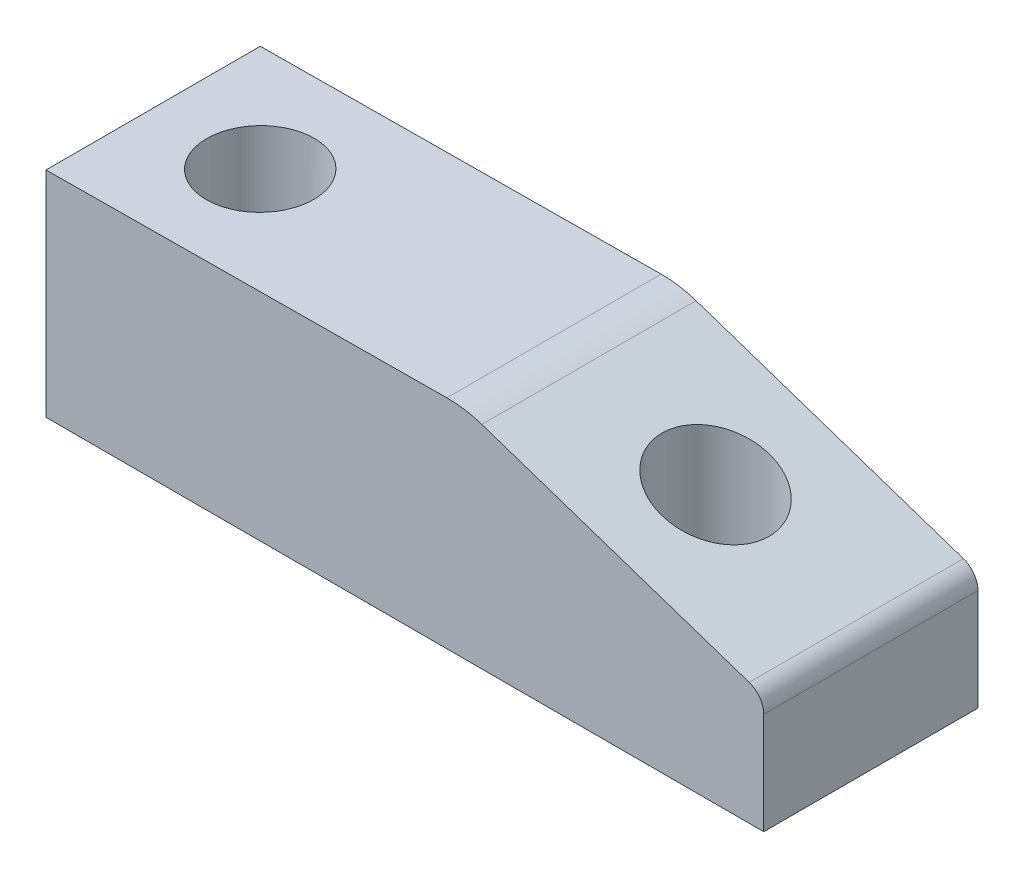
ISO-10303-21;
HEADER;
FILE_DESCRIPTION(('STEP AP214'),'2;1');
FILE_NAME('part.step','',(''),(''),'','','');
FILE_SCHEMA(('AUTOMOTIVE_DESIGN { 1 0 10303 214 1 1 1 1 }'));
ENDSEC;
DATA;
#1=APPLICATION_CONTEXT('core data for automotive mechanical design processes');
#2=APPLICATION_PROTOCOL_DEFINITION('international standard','automotive_design',2000,#1);
#3=PRODUCT_CONTEXT('',#1,'mechanical');
#4=PRODUCT('Part','Part','',(#3));
#5=PRODUCT_RELATED_PRODUCT_CATEGORY('part','',(#4));
#6=PRODUCT_DEFINITION_FORMATION('','',#4);
#7=PRODUCT_DEFINITION_CONTEXT('part definition',#1,'design');
#8=PRODUCT_DEFINITION('design','',#6,#7);
#9=PRODUCT_DEFINITION_SHAPE('','',#8);
#10=(LENGTH_UNIT() NAMED_UNIT(*) SI_UNIT(.MILLI.,.METRE.));
#11=(NAMED_UNIT(*) PLANE_ANGLE_UNIT() SI_UNIT($,.RADIAN.));
#12=(NAMED_UNIT(*) SI_UNIT($,.STERADIAN.) SOLID_ANGLE_UNIT());
#13=UNCERTAINTY_MEASURE_WITH_UNIT(LENGTH_MEASURE(1.E-05),#10,'distance_accuracy_value','');
#14=(GEOMETRIC_REPRESENTATION_CONTEXT(3) GLOBAL_UNCERTAINTY_ASSIGNED_CONTEXT((#13)) GLOBAL_UNIT_ASSIGNED_CONTEXT((#10,
#11,#12)) REPRESENTATION_CONTEXT('',''));
#15=CARTESIAN_POINT('',(0.,0.,0.));
#16=DIRECTION('',(0.,0.,1.));
#17=DIRECTION('',(1.,0.,0.));
#18=AXIS2_PLACEMENT_3D('',#15,#16,#17);
#19=CARTESIAN_POINT('',(81.3639693898569,39.5436866750321,20.));
#20=DIRECTION('',(-0.318198469492847,-0.948024121007694,0.));
#21=DIRECTION('',(0.948024121007694,-0.318198469492847,0.));
#22=AXIS2_PLACEMENT_3D('',#19,#20,#21);
#23=PLANE('',#22);
#24=DIRECTION('',(-0.948024121007693,0.318198469492847,0.));
#25=VECTOR('',#24,1.);
#26=CARTESIAN_POINT('',(81.3639693898569,39.5436866750321,-20.));
#27=LINE('',#26,#25);
#28=CARTESIAN_POINT('',(131.272793877971,22.7920964840308,-20.));
#29=VERTEX_POINT('',#28);
#30=CARTESIAN_POINT('',(81.3639693898569,39.5436866750321,-20.));
#31=VERTEX_POINT('',#30);
#32=EDGE_CURVE('E139',#29,#31,#27,.T.);
#33=ORIENTED_EDGE('',*,*,#32,.T.);
#34=DIRECTION('',(0.,0.,-1.));
#35=VECTOR('',#34,1.);
#36=CARTESIAN_POINT('',(81.3639693898569,39.5436866750321,20.));
#37=LINE('',#36,#35);
#38=CARTESIAN_POINT('',(81.3639693898569,39.5436866750321,20.));
#39=VERTEX_POINT('',#38);
#40=EDGE_CURVE('E121',#39,#31,#37,.T.);
#41=ORIENTED_EDGE('',*,*,#40,.F.);
#42=DIRECTION('',(-0.948024121007693,0.318198469492847,0.));
#43=VECTOR('',#42,1.);
#44=CARTESIAN_POINT('',(81.3639693898569,39.5436866750321,20.));
#45=LINE('',#44,#43);
#46=CARTESIAN_POINT('',(131.272793877971,22.7920964840308,20.));
#47=VERTEX_POINT('',#46);
#48=EDGE_CURVE('E112',#47,#39,#45,.T.);
#49=ORIENTED_EDGE('',*,*,#48,.F.);
#50=DIRECTION('',(0.,0.,-1.));
#51=VECTOR('',#50,1.);
#52=CARTESIAN_POINT('',(131.272793877971,22.7920964840308,20.));
#53=LINE('',#52,#51);
#54=EDGE_CURVE('E148',#47,#29,#53,.T.);
#55=ORIENTED_EDGE('',*,*,#54,.T.);
#56=EDGE_LOOP('',(#33,#41,#49,#55));
#57=FACE_BOUND('',#56,.T.);
#58=CARTESIAN_POINT('',(105.,31.6103982719488,0.));
#59=DIRECTION('',(-0.318198469492847,-0.948024121007694,0.));
#60=DIRECTION('',(0.948024121007694,-0.318198469492847,0.));
#61=AXIS2_PLACEMENT_3D('',#58,#59,#60);
#62=ELLIPSE('',#61,10.5482548158907,9.99999999999999);
#63=CARTESIAN_POINT('',(115.,28.2539597337118,0.));
#64=VERTEX_POINT('',#63);
#65=EDGE_CURVE('E41',#64,#64,#62,.F.);
#66=ORIENTED_EDGE('',*,*,#65,.F.);
#67=EDGE_LOOP('',(#66));
#68=FACE_BOUND('',#67,.T.);
#69=ADVANCED_FACE('F37',(#57,#68),#23,.F.);
#70=CARTESIAN_POINT('',(0.,40.,20.));
#71=DIRECTION('',(0.00778389982458456,-0.999969704992867,0.));
#72=DIRECTION('',(0.999969704992867,0.00778389982458456,0.));
#73=AXIS2_PLACEMENT_3D('',#70,#71,#72);
#74=PLANE('',#73);
#75=DIRECTION('',(-0.999969704992867,-0.00778389982458455,0.));
#76=VECTOR('',#75,1.);
#77=CARTESIAN_POINT('',(0.,40.,-20.));
#78=LINE('',#77,#76);
#79=CARTESIAN_POINT('',(74.8443220035083,40.5825983547356,-20.));
#80=VERTEX_POINT('',#79);
#81=CARTESIAN_POINT('',(0.,40.,-20.));
#82=VERTEX_POINT('',#81);
#83=EDGE_CURVE('E82',#80,#82,#78,.T.);
#84=ORIENTED_EDGE('',*,*,#83,.T.);
#85=DIRECTION('',(0.,0.,-1.));
#86=VECTOR('',#85,1.);
#87=CARTESIAN_POINT('',(0.,40.,20.));
#88=LINE('',#87,#86);
#89=CARTESIAN_POINT('',(0.,40.,20.));
#90=VERTEX_POINT('',#89);
#91=EDGE_CURVE('E122',#90,#82,#88,.T.);
#92=ORIENTED_EDGE('',*,*,#91,.F.);
#93=DIRECTION('',(-0.999969704992867,-0.00778389982458455,0.));
#94=VECTOR('',#93,1.);
#95=CARTESIAN_POINT('',(0.,40.,20.));
#96=LINE('',#95,#94);
#97=CARTESIAN_POINT('',(74.8443220035083,40.5825983547356,20.));
#98=VERTEX_POINT('',#97);
#99=EDGE_CURVE('E110',#98,#90,#96,.T.);
#100=ORIENTED_EDGE('',*,*,#99,.F.);
#101=DIRECTION('',(0.,0.,-1.));
#102=VECTOR('',#101,1.);
#103=CARTESIAN_POINT('',(74.8443220035083,40.5825983547356,20.));
#104=LINE('',#103,#102);
#105=EDGE_CURVE('E117',#98,#80,#104,.T.);
#106=ORIENTED_EDGE('',*,*,#105,.T.);
#107=EDGE_LOOP('',(#84,#92,#100,#106));
#108=FACE_BOUND('',#107,.T.);
#109=CARTESIAN_POINT('',(20.,40.1556827129006,0.));
#110=DIRECTION('',(0.00778389982458456,-0.999969704992867,0.));
#111=DIRECTION('',(-0.999969704992867,-0.00778389982458456,0.));
#112=AXIS2_PLACEMENT_3D('',#109,#110,#111);
#113=ELLIPSE('',#112,10.0003029592495,10.);
#114=CARTESIAN_POINT('',(10.,40.0778413564503,0.));
#115=VERTEX_POINT('',#114);
#116=EDGE_CURVE('E152',#115,#115,#113,.F.);
#117=ORIENTED_EDGE('',*,*,#116,.F.);
#118=EDGE_LOOP('',(#117));
#119=FACE_BOUND('',#118,.T.);
#120=ADVANCED_FACE('F124',(#108,#119),#74,.F.);
#121=CARTESIAN_POINT('',(20.,40.5832042548782,0.));
#122=DIRECTION('',(0.,-1.,0.));
#123=DIRECTION('',(0.,0.,-1.));
#124=AXIS2_PLACEMENT_3D('',#121,#122,#123);
#125=CYLINDRICAL_SURFACE('',#124,6.);
#126=CARTESIAN_POINT('',(20.,0.,0.));
#127=DIRECTION('',(0.,1.,0.));
#128=DIRECTION('',(0.,0.,1.));
#129=AXIS2_PLACEMENT_3D('',#126,#127,#128);
#130=CIRCLE('',#129,6.);
#131=CARTESIAN_POINT('',(20.,0.,6.));
#132=VERTEX_POINT('',#131);
#133=EDGE_CURVE('E135',#132,#132,#130,.T.);
#134=ORIENTED_EDGE('',*,*,#133,.F.);
#135=EDGE_LOOP('',(#134));
#136=FACE_BOUND('',#135,.T.);
#137=CARTESIAN_POINT('',(20.,10.,0.));
#138=DIRECTION('',(0.,1.,0.));
#139=DIRECTION('',(0.,0.,1.));
#140=AXIS2_PLACEMENT_3D('',#137,#138,#139);
#141=CIRCLE('',#140,6.);
#142=CARTESIAN_POINT('',(20.,10.,6.));
#143=VERTEX_POINT('',#142);
#144=EDGE_CURVE('E160',#143,#143,#141,.T.);
#145=ORIENTED_EDGE('',*,*,#144,.T.);
#146=EDGE_LOOP('',(#145));
#147=FACE_BOUND('',#146,.T.);
#148=ADVANCED_FACE('F210',(#136,#147),#125,.F.);
#149=CARTESIAN_POINT('',(105.,40.5832042548782,0.));
#150=DIRECTION('',(0.,-1.,0.));
#151=DIRECTION('',(0.,0.,-1.));
#152=AXIS2_PLACEMENT_3D('',#149,#150,#151);
#153=CYLINDRICAL_SURFACE('',#152,6.);
#154=CARTESIAN_POINT('',(105.,0.,0.));
#155=DIRECTION('',(0.,1.,0.));
#156=DIRECTION('',(0.,0.,1.));
#157=AXIS2_PLACEMENT_3D('',#154,#155,#156);
#158=CIRCLE('',#157,6.);
#159=CARTESIAN_POINT('',(105.,0.,6.));
#160=VERTEX_POINT('',#159);
#161=EDGE_CURVE('E158',#160,#160,#158,.T.);
#162=ORIENTED_EDGE('',*,*,#161,.F.);
#163=EDGE_LOOP('',(#162));
#164=FACE_BOUND('',#163,.T.);
#165=CARTESIAN_POINT('',(105.,10.,0.));
#166=DIRECTION('',(0.,1.,0.));
#167=DIRECTION('',(0.,0.,1.));
#168=AXIS2_PLACEMENT_3D('',#165,#166,#167);
#169=CIRCLE('',#168,6.);
#170=CARTESIAN_POINT('',(105.,10.,6.));
#171=VERTEX_POINT('',#170);
#172=EDGE_CURVE('E168',#171,#171,#169,.T.);
#173=ORIENTED_EDGE('',*,*,#172,.T.);
#174=EDGE_LOOP('',(#173));
#175=FACE_BOUND('',#174,.T.);
#176=ADVANCED_FACE('F218',(#164,#175),#153,.F.);
#177=CARTESIAN_POINT('',(134.,0.,20.));
#178=DIRECTION('',(0.,1.,0.));
#179=DIRECTION('',(-1.,0.,0.));
#180=AXIS2_PLACEMENT_3D('',#177,#178,#179);
#181=PLANE('',#180);
#182=ORIENTED_EDGE('',*,*,#133,.T.);
#183=EDGE_LOOP('',(#182));
#184=FACE_BOUND('',#183,.T.);
#185=ORIENTED_EDGE('',*,*,#161,.T.);
#186=EDGE_LOOP('',(#185));
#187=FACE_BOUND('',#186,.T.);
#188=DIRECTION('',(1.,0.,0.));
#189=VECTOR('',#188,1.);
#190=CARTESIAN_POINT('',(134.,0.,-20.));
#191=LINE('',#190,#189);
#192=CARTESIAN_POINT('',(0.,0.,-20.));
#193=VERTEX_POINT('',#192);
#194=CARTESIAN_POINT('',(134.,0.,-20.));
#195=VERTEX_POINT('',#194);
#196=EDGE_CURVE('E131',#193,#195,#191,.T.);
#197=ORIENTED_EDGE('',*,*,#196,.T.);
#198=DIRECTION('',(0.,0.,-1.));
#199=VECTOR('',#198,1.);
#200=CARTESIAN_POINT('',(134.,0.,20.));
#201=LINE('',#200,#199);
#202=CARTESIAN_POINT('',(134.,0.,20.));
#203=VERTEX_POINT('',#202);
#204=EDGE_CURVE('E11',#203,#195,#201,.T.);
#205=ORIENTED_EDGE('',*,*,#204,.F.);
#206=DIRECTION('',(1.,0.,0.));
#207=VECTOR('',#206,1.);
#208=CARTESIAN_POINT('',(134.,0.,20.));
#209=LINE('',#208,#207);
#210=CARTESIAN_POINT('',(0.,0.,20.));
#211=VERTEX_POINT('',#210);
#212=EDGE_CURVE('E144',#211,#203,#209,.T.);
#213=ORIENTED_EDGE('',*,*,#212,.F.);
#214=DIRECTION('',(0.,0.,-1.));
#215=VECTOR('',#214,1.);
#216=CARTESIAN_POINT('',(0.,0.,20.));
#217=LINE('',#216,#215);
#218=EDGE_CURVE('E127',#211,#193,#217,.T.);
#219=ORIENTED_EDGE('',*,*,#218,.T.);
#220=EDGE_LOOP('',(#197,#205,#213,#219));
#221=FACE_BOUND('',#220,.T.);
#222=ADVANCED_FACE('F39',(#184,#187,#221),#181,.F.);
#223=CARTESIAN_POINT('',(134.,19.,20.));
#224=DIRECTION('',(-1.,0.,0.));
#225=DIRECTION('',(0.,0.,1.));
#226=AXIS2_PLACEMENT_3D('',#223,#224,#225);
#227=PLANE('',#226);
#228=DIRECTION('',(0.,1.,0.));
#229=VECTOR('',#228,1.);
#230=CARTESIAN_POINT('',(134.,19.,-20.));
#231=LINE('',#230,#229);
#232=CARTESIAN_POINT('',(134.,19.,-20.));
#233=VERTEX_POINT('',#232);
#234=EDGE_CURVE('E134',#195,#233,#231,.T.);
#235=ORIENTED_EDGE('',*,*,#234,.T.);
#236=DIRECTION('',(0.,0.,-1.));
#237=VECTOR('',#236,1.);
#238=CARTESIAN_POINT('',(134.,19.,20.));
#239=LINE('',#238,#237);
#240=CARTESIAN_POINT('',(134.,19.,20.));
#241=VERTEX_POINT('',#240);
#242=EDGE_CURVE('E47',#241,#233,#239,.T.);
#243=ORIENTED_EDGE('',*,*,#242,.F.);
#244=DIRECTION('',(0.,1.,0.));
#245=VECTOR('',#244,1.);
#246=CARTESIAN_POINT('',(134.,19.,20.));
#247=LINE('',#246,#245);
#248=EDGE_CURVE('E96',#203,#241,#247,.T.);
#249=ORIENTED_EDGE('',*,*,#248,.F.);
#250=ORIENTED_EDGE('',*,*,#204,.T.);
#251=EDGE_LOOP('',(#235,#243,#249,#250));
#252=FACE_BOUND('',#251,.T.);
#253=ADVANCED_FACE('F213',(#252),#227,.F.);
#254=CARTESIAN_POINT('',(130.,19.,20.));
#255=DIRECTION('',(0.,0.,-1.));
#256=DIRECTION('',(-1.,0.,0.));
#257=AXIS2_PLACEMENT_3D('',#254,#255,#256);
#258=CYLINDRICAL_SURFACE('',#257,4.);
#259=CARTESIAN_POINT('',(130.,19.,-20.));
#260=DIRECTION('',(0.,0.,1.));
#261=DIRECTION('',(-1.,0.,0.));
#262=AXIS2_PLACEMENT_3D('',#259,#260,#261);
#263=CIRCLE('',#262,4.);
#264=EDGE_CURVE('E137',#233,#29,#263,.T.);
#265=ORIENTED_EDGE('',*,*,#264,.T.);
#266=ORIENTED_EDGE('',*,*,#54,.F.);
#267=CARTESIAN_POINT('',(130.,19.,20.));
#268=DIRECTION('',(0.,0.,1.));
#269=DIRECTION('',(-1.,0.,0.));
#270=AXIS2_PLACEMENT_3D('',#267,#268,#269);
#271=CIRCLE('',#270,4.);
#272=EDGE_CURVE('E179',#241,#47,#271,.T.);
#273=ORIENTED_EDGE('',*,*,#272,.F.);
#274=ORIENTED_EDGE('',*,*,#242,.T.);
#275=EDGE_LOOP('',(#265,#266,#273,#274));
#276=FACE_BOUND('',#275,.T.);
#277=ADVANCED_FACE('F183',(#276),#258,.T.);
#278=CARTESIAN_POINT('',(75.,20.5832042548782,20.));
#279=DIRECTION('',(0.,0.,-1.));
#280=DIRECTION('',(-1.,0.,0.));
#281=AXIS2_PLACEMENT_3D('',#278,#279,#280);
#282=CYLINDRICAL_SURFACE('',#281,20.);
#283=CARTESIAN_POINT('',(75.,20.5832042548782,-20.));
#284=DIRECTION('',(0.,0.,1.));
#285=DIRECTION('',(1.,0.,0.));
#286=AXIS2_PLACEMENT_3D('',#283,#284,#285);
#287=CIRCLE('',#286,20.);
#288=EDGE_CURVE('E120',#31,#80,#287,.T.);
#289=ORIENTED_EDGE('',*,*,#288,.T.);
#290=ORIENTED_EDGE('',*,*,#105,.F.);
#291=CARTESIAN_POINT('',(75.,20.5832042548782,20.));
#292=DIRECTION('',(0.,0.,1.));
#293=DIRECTION('',(1.,0.,0.));
#294=AXIS2_PLACEMENT_3D('',#291,#292,#293);
#295=CIRCLE('',#294,20.);
#296=EDGE_CURVE('E106',#39,#98,#295,.T.);
#297=ORIENTED_EDGE('',*,*,#296,.F.);
#298=ORIENTED_EDGE('',*,*,#40,.T.);
#299=EDGE_LOOP('',(#289,#290,#297,#298));
#300=FACE_BOUND('',#299,.T.);
#301=ADVANCED_FACE('F118',(#300),#282,.T.);
#302=CARTESIAN_POINT('',(0.,0.,20.));
#303=DIRECTION('',(1.,0.,0.));
#304=DIRECTION('',(0.,0.,-1.));
#305=AXIS2_PLACEMENT_3D('',#302,#303,#304);
#306=PLANE('',#305);
#307=DIRECTION('',(0.,-1.,0.));
#308=VECTOR('',#307,1.);
#309=CARTESIAN_POINT('',(0.,0.,-20.));
#310=LINE('',#309,#308);
#311=EDGE_CURVE('E88',#82,#193,#310,.T.);
#312=ORIENTED_EDGE('',*,*,#311,.T.);
#313=ORIENTED_EDGE('',*,*,#218,.F.);
#314=DIRECTION('',(0.,-1.,0.));
#315=VECTOR('',#314,1.);
#316=CARTESIAN_POINT('',(0.,0.,20.));
#317=LINE('',#316,#315);
#318=EDGE_CURVE('E56',#90,#211,#317,.T.);
#319=ORIENTED_EDGE('',*,*,#318,.F.);
#320=ORIENTED_EDGE('',*,*,#91,.T.);
#321=EDGE_LOOP('',(#312,#313,#319,#320));
#322=FACE_BOUND('',#321,.T.);
#323=ADVANCED_FACE('F194',(#322),#306,.F.);
#324=CARTESIAN_POINT('',(75.,20.5832042548782,20.));
#325=DIRECTION('',(0.,0.,1.));
#326=DIRECTION('',(1.,0.,0.));
#327=AXIS2_PLACEMENT_3D('',#324,#325,#326);
#328=PLANE('',#327);
#329=ORIENTED_EDGE('',*,*,#212,.T.);
#330=ORIENTED_EDGE('',*,*,#248,.T.);
#331=ORIENTED_EDGE('',*,*,#272,.T.);
#332=ORIENTED_EDGE('',*,*,#48,.T.);
#333=ORIENTED_EDGE('',*,*,#296,.T.);
#334=ORIENTED_EDGE('',*,*,#99,.T.);
#335=ORIENTED_EDGE('',*,*,#318,.T.);
#336=EDGE_LOOP('',(#329,#330,#331,#332,#333,#334,#335));
#337=FACE_BOUND('',#336,.T.);
#338=ADVANCED_FACE('F108',(#337),#328,.T.);
#339=CARTESIAN_POINT('',(75.,20.5832042548782,-20.));
#340=DIRECTION('',(0.,0.,1.));
#341=DIRECTION('',(1.,0.,0.));
#342=AXIS2_PLACEMENT_3D('',#339,#340,#341);
#343=PLANE('',#342);
#344=ORIENTED_EDGE('',*,*,#196,.F.);
#345=ORIENTED_EDGE('',*,*,#311,.F.);
#346=ORIENTED_EDGE('',*,*,#83,.F.);
#347=ORIENTED_EDGE('',*,*,#288,.F.);
#348=ORIENTED_EDGE('',*,*,#32,.F.);
#349=ORIENTED_EDGE('',*,*,#264,.F.);
#350=ORIENTED_EDGE('',*,*,#234,.F.);
#351=EDGE_LOOP('',(#344,#345,#346,#347,#348,#349,#350));
#352=FACE_BOUND('',#351,.T.);
#353=ADVANCED_FACE('F190',(#352),#343,.F.);
#354=CARTESIAN_POINT('',(105.,40.5832042548782,0.));
#355=DIRECTION('',(0.,-1.,0.));
#356=DIRECTION('',(0.,0.,-1.));
#357=AXIS2_PLACEMENT_3D('',#354,#355,#356);
#358=CYLINDRICAL_SURFACE('',#357,9.99999999999999);
#359=CARTESIAN_POINT('',(105.,10.,0.));
#360=DIRECTION('',(0.,1.,0.));
#361=DIRECTION('',(0.,0.,1.));
#362=AXIS2_PLACEMENT_3D('',#359,#360,#361);
#363=CIRCLE('',#362,9.99999999999999);
#364=CARTESIAN_POINT('',(105.,10.,9.99999999999999));
#365=VERTEX_POINT('',#364);
#366=EDGE_CURVE('E165',#365,#365,#363,.T.);
#367=ORIENTED_EDGE('',*,*,#366,.F.);
#368=EDGE_LOOP('',(#367));
#369=FACE_BOUND('',#368,.T.);
#370=ORIENTED_EDGE('',*,*,#65,.T.);
#371=EDGE_LOOP('',(#370));
#372=FACE_BOUND('',#371,.T.);
#373=ADVANCED_FACE('F234',(#369,#372),#358,.F.);
#374=CARTESIAN_POINT('',(105.,10.,0.));
#375=DIRECTION('',(0.,1.,0.));
#376=DIRECTION('',(0.,0.,1.));
#377=AXIS2_PLACEMENT_3D('',#374,#375,#376);
#378=PLANE('',#377);
#379=ORIENTED_EDGE('',*,*,#366,.T.);
#380=EDGE_LOOP('',(#379));
#381=FACE_BOUND('',#380,.T.);
#382=ORIENTED_EDGE('',*,*,#172,.F.);
#383=EDGE_LOOP('',(#382));
#384=FACE_BOUND('',#383,.T.);
#385=ADVANCED_FACE('F231',(#381,#384),#378,.T.);
#386=CARTESIAN_POINT('',(20.,40.5832042548782,0.));
#387=DIRECTION('',(0.,-1.,0.));
#388=DIRECTION('',(0.,0.,-1.));
#389=AXIS2_PLACEMENT_3D('',#386,#387,#388);
#390=CYLINDRICAL_SURFACE('',#389,10.);
#391=CARTESIAN_POINT('',(20.,10.,0.));
#392=DIRECTION('',(0.,1.,0.));
#393=DIRECTION('',(0.,0.,1.));
#394=AXIS2_PLACEMENT_3D('',#391,#392,#393);
#395=CIRCLE('',#394,10.);
#396=CARTESIAN_POINT('',(20.,10.,10.));
#397=VERTEX_POINT('',#396);
#398=EDGE_CURVE('E154',#397,#397,#395,.T.);
#399=ORIENTED_EDGE('',*,*,#398,.F.);
#400=EDGE_LOOP('',(#399));
#401=FACE_BOUND('',#400,.T.);
#402=ORIENTED_EDGE('',*,*,#116,.T.);
#403=EDGE_LOOP('',(#402));
#404=FACE_BOUND('',#403,.T.);
#405=ADVANCED_FACE('F233',(#401,#404),#390,.F.);
#406=CARTESIAN_POINT('',(20.,10.,0.));
#407=DIRECTION('',(0.,1.,0.));
#408=DIRECTION('',(0.,0.,1.));
#409=AXIS2_PLACEMENT_3D('',#406,#407,#408);
#410=PLANE('',#409);
#411=ORIENTED_EDGE('',*,*,#398,.T.);
#412=EDGE_LOOP('',(#411));
#413=FACE_BOUND('',#412,.T.);
#414=ORIENTED_EDGE('',*,*,#144,.F.);
#415=EDGE_LOOP('',(#414));
#416=FACE_BOUND('',#415,.T.);
#417=ADVANCED_FACE('F241',(#413,#416),#410,.T.);
#418=CLOSED_SHELL('',(#69,#120,#148,#176,#222,#253,#277,#301,#323,#338,#353,#373,#385,#405,#417));
#419=MANIFOLD_SOLID_BREP('B2',#418);
#420=ADVANCED_BREP_SHAPE_REPRESENTATION('',(#18,#419),#14);
#421=SHAPE_DEFINITION_REPRESENTATION(#9,#420);
ENDSEC;
END-ISO-10303-21;
